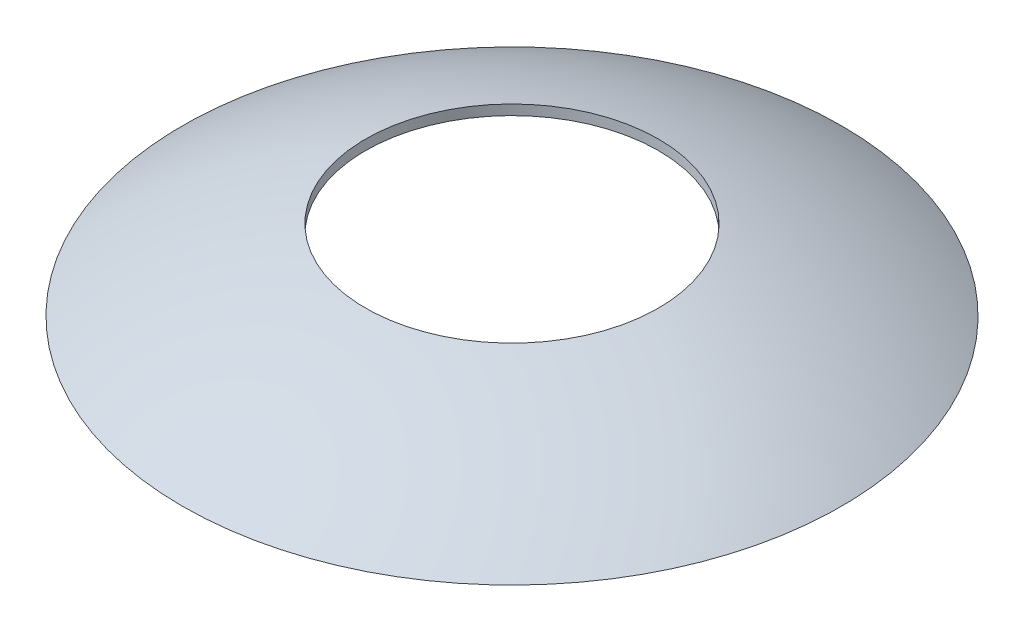
ISO-10303-21;
HEADER;
FILE_DESCRIPTION(('STEP AP214'),'2;1');
FILE_NAME('part.step','',(''),(''),'','','');
FILE_SCHEMA(('AUTOMOTIVE_DESIGN { 1 0 10303 214 1 1 1 1 }'));
ENDSEC;
DATA;
#1=APPLICATION_CONTEXT('core data for automotive mechanical design processes');
#2=APPLICATION_PROTOCOL_DEFINITION('international standard','automotive_design',2000,#1);
#3=PRODUCT_CONTEXT('',#1,'mechanical');
#4=PRODUCT('Part','Part','',(#3));
#5=PRODUCT_RELATED_PRODUCT_CATEGORY('part','',(#4));
#6=PRODUCT_DEFINITION_FORMATION('','',#4);
#7=PRODUCT_DEFINITION_CONTEXT('part definition',#1,'design');
#8=PRODUCT_DEFINITION('design','',#6,#7);
#9=PRODUCT_DEFINITION_SHAPE('','',#8);
#10=(LENGTH_UNIT() NAMED_UNIT(*) SI_UNIT(.MILLI.,.METRE.));
#11=(NAMED_UNIT(*) PLANE_ANGLE_UNIT() SI_UNIT($,.RADIAN.));
#12=(NAMED_UNIT(*) SI_UNIT($,.STERADIAN.) SOLID_ANGLE_UNIT());
#13=UNCERTAINTY_MEASURE_WITH_UNIT(LENGTH_MEASURE(1.E-05),#10,'distance_accuracy_value','');
#14=(GEOMETRIC_REPRESENTATION_CONTEXT(3) GLOBAL_UNCERTAINTY_ASSIGNED_CONTEXT((#13)) GLOBAL_UNIT_ASSIGNED_CONTEXT((#10,
#11,#12)) REPRESENTATION_CONTEXT('',''));
#15=CARTESIAN_POINT('',(0.,0.,0.));
#16=DIRECTION('',(0.,0.,1.));
#17=DIRECTION('',(1.,0.,0.));
#18=AXIS2_PLACEMENT_3D('',#15,#16,#17);
#19=CARTESIAN_POINT('',(0.,-10.1990152792965,0.));
#20=DIRECTION('',(0.,-1.,0.));
#21=DIRECTION('',(0.,0.,-1.));
#22=AXIS2_PLACEMENT_3D('',#19,#20,#21);
#23=DEGENERATE_TOROIDAL_SURFACE('',#22,0.0567732505788151,12.1991473876862,.T.);
#24=CARTESIAN_POINT('',(0.,1.63976055640469,0.));
#25=DIRECTION('',(0.,-1.,0.));
#26=DIRECTION('',(0.,0.,-1.));
#27=AXIS2_PLACEMENT_3D('',#24,#25,#26);
#28=CIRCLE('',#27,3.);
#29=CARTESIAN_POINT('',(0.,1.63976055640469,-3.));
#30=VERTEX_POINT('',#29);
#31=EDGE_CURVE('E44',#30,#30,#28,.T.);
#32=ORIENTED_EDGE('',*,*,#31,.T.);
#33=EDGE_LOOP('',(#32));
#34=FACE_BOUND('',#33,.T.);
#35=CARTESIAN_POINT('',(0.,0.,0.));
#36=DIRECTION('',(0.,-1.,0.));
#37=DIRECTION('',(0.,0.,-1.));
#38=AXIS2_PLACEMENT_3D('',#35,#36,#37);
#39=CIRCLE('',#38,6.75000000000001);
#40=CARTESIAN_POINT('',(0.,0.,-6.75000000000001));
#41=VERTEX_POINT('',#40);
#42=EDGE_CURVE('E10',#41,#41,#39,.T.);
#43=ORIENTED_EDGE('',*,*,#42,.F.);
#44=EDGE_LOOP('',(#43));
#45=FACE_BOUND('',#44,.T.);
#46=ADVANCED_FACE('F30',(#34,#45),#23,.T.);
#47=CARTESIAN_POINT('',(6.75000000000001,0.,0.));
#48=DIRECTION('',(0.,-1.,0.));
#49=DIRECTION('',(0.,0.,-1.));
#50=AXIS2_PLACEMENT_3D('',#47,#48,#49);
#51=PLANE('',#50);
#52=ORIENTED_EDGE('',*,*,#42,.T.);
#53=EDGE_LOOP('',(#52));
#54=FACE_BOUND('',#53,.T.);
#55=CARTESIAN_POINT('',(0.,0.,0.));
#56=DIRECTION('',(0.,-1.,0.));
#57=DIRECTION('',(0.,0.,-1.));
#58=AXIS2_PLACEMENT_3D('',#55,#56,#57);
#59=CIRCLE('',#58,6.37813586983211);
#60=CARTESIAN_POINT('',(0.,0.,-6.37813586983211));
#61=VERTEX_POINT('',#60);
#62=EDGE_CURVE('E36',#61,#61,#59,.T.);
#63=ORIENTED_EDGE('',*,*,#62,.F.);
#64=EDGE_LOOP('',(#63));
#65=FACE_BOUND('',#64,.T.);
#66=ADVANCED_FACE('F60',(#54,#65),#51,.T.);
#67=CARTESIAN_POINT('',(0.,-10.1990152792965,0.));
#68=DIRECTION('',(0.,-1.,0.));
#69=DIRECTION('',(0.,0.,-1.));
#70=AXIS2_PLACEMENT_3D('',#67,#68,#69);
#71=DEGENERATE_TOROIDAL_SURFACE('',#70,0.0567732505788151,11.9991473876862,.T.);
#72=ORIENTED_EDGE('',*,*,#62,.T.);
#73=EDGE_LOOP('',(#72));
#74=FACE_BOUND('',#73,.T.);
#75=CARTESIAN_POINT('',(0.,1.43356630575623,0.));
#76=DIRECTION('',(0.,-1.,0.));
#77=DIRECTION('',(0.,0.,-1.));
#78=AXIS2_PLACEMENT_3D('',#75,#76,#77);
#79=CIRCLE('',#78,3.);
#80=CARTESIAN_POINT('',(0.,1.43356630575623,-3.));
#81=VERTEX_POINT('',#80);
#82=EDGE_CURVE('E40',#81,#81,#79,.T.);
#83=ORIENTED_EDGE('',*,*,#82,.F.);
#84=EDGE_LOOP('',(#83));
#85=FACE_BOUND('',#84,.T.);
#86=ADVANCED_FACE('F54',(#74,#85),#71,.F.);
#87=CARTESIAN_POINT('',(0.,0.,0.));
#88=DIRECTION('',(0.,-1.,0.));
#89=DIRECTION('',(0.,0.,-1.));
#90=AXIS2_PLACEMENT_3D('',#87,#88,#89);
#91=CYLINDRICAL_SURFACE('',#90,3.);
#92=ORIENTED_EDGE('',*,*,#82,.T.);
#93=EDGE_LOOP('',(#92));
#94=FACE_BOUND('',#93,.T.);
#95=ORIENTED_EDGE('',*,*,#31,.F.);
#96=EDGE_LOOP('',(#95));
#97=FACE_BOUND('',#96,.T.);
#98=ADVANCED_FACE('F52',(#94,#97),#91,.F.);
#99=CLOSED_SHELL('',(#46,#66,#86,#98));
#100=MANIFOLD_SOLID_BREP('B2',#99);
#101=ADVANCED_BREP_SHAPE_REPRESENTATION('',(#18,#100),#14);
#102=SHAPE_DEFINITION_REPRESENTATION(#9,#101);
ENDSEC;
END-ISO-10303-21;
